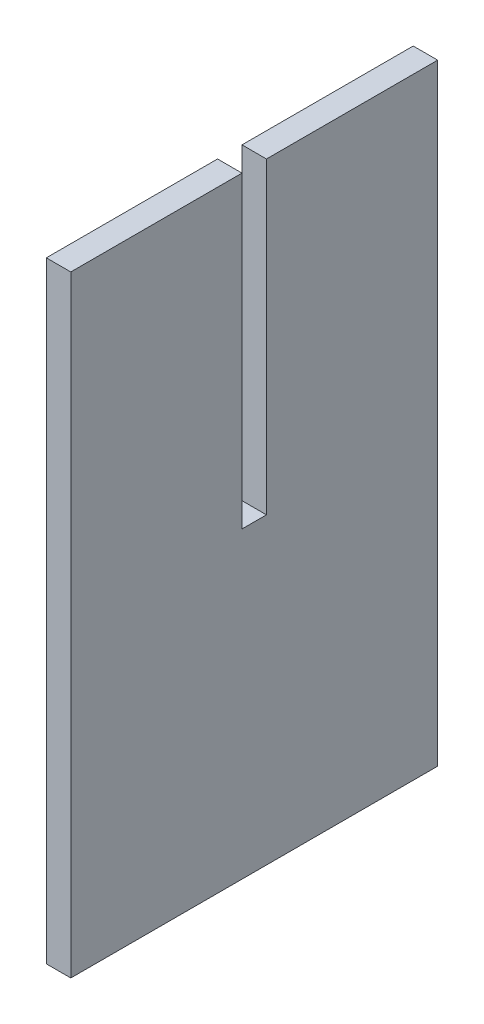
ISO-10303-21;
HEADER;
FILE_DESCRIPTION(('STEP AP214'),'2;1');
FILE_NAME('part.step','',(''),(''),'','','');
FILE_SCHEMA(('AUTOMOTIVE_DESIGN { 1 0 10303 214 1 1 1 1 }'));
ENDSEC;
DATA;
#1=APPLICATION_CONTEXT('core data for automotive mechanical design processes');
#2=APPLICATION_PROTOCOL_DEFINITION('international standard','automotive_design',2000,#1);
#3=PRODUCT_CONTEXT('',#1,'mechanical');
#4=PRODUCT('Part','Part','',(#3));
#5=PRODUCT_RELATED_PRODUCT_CATEGORY('part','',(#4));
#6=PRODUCT_DEFINITION_FORMATION('','',#4);
#7=PRODUCT_DEFINITION_CONTEXT('part definition',#1,'design');
#8=PRODUCT_DEFINITION('design','',#6,#7);
#9=PRODUCT_DEFINITION_SHAPE('','',#8);
#10=(LENGTH_UNIT() NAMED_UNIT(*) SI_UNIT(.MILLI.,.METRE.));
#11=(NAMED_UNIT(*) PLANE_ANGLE_UNIT() SI_UNIT($,.RADIAN.));
#12=(NAMED_UNIT(*) SI_UNIT($,.STERADIAN.) SOLID_ANGLE_UNIT());
#13=UNCERTAINTY_MEASURE_WITH_UNIT(LENGTH_MEASURE(1.E-05),#10,'distance_accuracy_value','');
#14=(GEOMETRIC_REPRESENTATION_CONTEXT(3) GLOBAL_UNCERTAINTY_ASSIGNED_CONTEXT((#13)) GLOBAL_UNIT_ASSIGNED_CONTEXT((#10,
#11,#12)) REPRESENTATION_CONTEXT('',''));
#15=CARTESIAN_POINT('',(0.,0.,0.));
#16=DIRECTION('',(0.,0.,1.));
#17=DIRECTION('',(1.,0.,0.));
#18=AXIS2_PLACEMENT_3D('',#15,#16,#17);
#19=CARTESIAN_POINT('',(2.,0.,0.));
#20=DIRECTION('',(0.,-1.,0.));
#21=DIRECTION('',(0.,0.,-1.));
#22=AXIS2_PLACEMENT_3D('',#19,#20,#21);
#23=PLANE('',#22);
#24=DIRECTION('',(0.,0.,1.));
#25=VECTOR('',#24,1.);
#26=CARTESIAN_POINT('',(2.,0.,0.));
#27=LINE('',#26,#25);
#28=CARTESIAN_POINT('',(2.,0.,-14.));
#29=VERTEX_POINT('',#28);
#30=CARTESIAN_POINT('',(2.,0.,0.));
#31=VERTEX_POINT('',#30);
#32=EDGE_CURVE('E59',#29,#31,#27,.T.);
#33=ORIENTED_EDGE('',*,*,#32,.F.);
#34=DIRECTION('',(1.,0.,0.));
#35=VECTOR('',#34,1.);
#36=CARTESIAN_POINT('',(0.,0.,-14.));
#37=LINE('',#36,#35);
#38=CARTESIAN_POINT('',(0.,0.,-14.));
#39=VERTEX_POINT('',#38);
#40=EDGE_CURVE('E135',#39,#29,#37,.T.);
#41=ORIENTED_EDGE('',*,*,#40,.F.);
#42=DIRECTION('',(0.,0.,1.));
#43=VECTOR('',#42,1.);
#44=CARTESIAN_POINT('',(0.,0.,0.));
#45=LINE('',#44,#43);
#46=CARTESIAN_POINT('',(0.,0.,0.));
#47=VERTEX_POINT('',#46);
#48=EDGE_CURVE('E81',#39,#47,#45,.T.);
#49=ORIENTED_EDGE('',*,*,#48,.T.);
#50=DIRECTION('',(-1.,0.,0.));
#51=VECTOR('',#50,1.);
#52=CARTESIAN_POINT('',(2.,0.,0.));
#53=LINE('',#52,#51);
#54=EDGE_CURVE('E151',#31,#47,#53,.T.);
#55=ORIENTED_EDGE('',*,*,#54,.F.);
#56=EDGE_LOOP('',(#33,#41,#49,#55));
#57=FACE_BOUND('',#56,.T.);
#58=ADVANCED_FACE('F35',(#57),#23,.F.);
#59=CARTESIAN_POINT('',(2.,0.,0.));
#60=DIRECTION('',(0.,0.,-1.));
#61=DIRECTION('',(0.,1.,0.));
#62=AXIS2_PLACEMENT_3D('',#59,#60,#61);
#63=PLANE('',#62);
#64=DIRECTION('',(0.,-1.,0.));
#65=VECTOR('',#64,1.);
#66=CARTESIAN_POINT('',(0.,0.,0.));
#67=LINE('',#66,#65);
#68=CARTESIAN_POINT('',(0.,-50.,0.));
#69=VERTEX_POINT('',#68);
#70=EDGE_CURVE('E137',#47,#69,#67,.T.);
#71=ORIENTED_EDGE('',*,*,#70,.T.);
#72=DIRECTION('',(-1.,0.,0.));
#73=VECTOR('',#72,1.);
#74=CARTESIAN_POINT('',(2.,-50.,0.));
#75=LINE('',#74,#73);
#76=CARTESIAN_POINT('',(2.,-50.,0.));
#77=VERTEX_POINT('',#76);
#78=EDGE_CURVE('E11',#77,#69,#75,.T.);
#79=ORIENTED_EDGE('',*,*,#78,.F.);
#80=DIRECTION('',(0.,-1.,0.));
#81=VECTOR('',#80,1.);
#82=CARTESIAN_POINT('',(2.,0.,0.));
#83=LINE('',#82,#81);
#84=EDGE_CURVE('E142',#31,#77,#83,.T.);
#85=ORIENTED_EDGE('',*,*,#84,.F.);
#86=ORIENTED_EDGE('',*,*,#54,.T.);
#87=EDGE_LOOP('',(#71,#79,#85,#86));
#88=FACE_BOUND('',#87,.T.);
#89=ADVANCED_FACE('F37',(#88),#63,.F.);
#90=CARTESIAN_POINT('',(2.,-50.,0.));
#91=DIRECTION('',(0.,1.,0.));
#92=DIRECTION('',(0.,0.,1.));
#93=AXIS2_PLACEMENT_3D('',#90,#91,#92);
#94=PLANE('',#93);
#95=DIRECTION('',(0.,0.,-1.));
#96=VECTOR('',#95,1.);
#97=CARTESIAN_POINT('',(0.,-50.,0.));
#98=LINE('',#97,#96);
#99=CARTESIAN_POINT('',(0.,-50.,-30.));
#100=VERTEX_POINT('',#99);
#101=EDGE_CURVE('E154',#69,#100,#98,.T.);
#102=ORIENTED_EDGE('',*,*,#101,.T.);
#103=DIRECTION('',(-1.,0.,0.));
#104=VECTOR('',#103,1.);
#105=CARTESIAN_POINT('',(2.,-50.,-30.));
#106=LINE('',#105,#104);
#107=CARTESIAN_POINT('',(2.,-50.,-30.));
#108=VERTEX_POINT('',#107);
#109=EDGE_CURVE('E43',#108,#100,#106,.T.);
#110=ORIENTED_EDGE('',*,*,#109,.F.);
#111=DIRECTION('',(0.,0.,-1.));
#112=VECTOR('',#111,1.);
#113=CARTESIAN_POINT('',(2.,-50.,0.));
#114=LINE('',#113,#112);
#115=EDGE_CURVE('E88',#77,#108,#114,.T.);
#116=ORIENTED_EDGE('',*,*,#115,.F.);
#117=ORIENTED_EDGE('',*,*,#78,.T.);
#118=EDGE_LOOP('',(#102,#110,#116,#117));
#119=FACE_BOUND('',#118,.T.);
#120=ADVANCED_FACE('F178',(#119),#94,.F.);
#121=CARTESIAN_POINT('',(2.,0.,-30.));
#122=DIRECTION('',(0.,0.,1.));
#123=DIRECTION('',(0.,-1.,0.));
#124=AXIS2_PLACEMENT_3D('',#121,#122,#123);
#125=PLANE('',#124);
#126=DIRECTION('',(0.,1.,0.));
#127=VECTOR('',#126,1.);
#128=CARTESIAN_POINT('',(0.,0.,-30.));
#129=LINE('',#128,#127);
#130=CARTESIAN_POINT('',(0.,0.,-30.));
#131=VERTEX_POINT('',#130);
#132=EDGE_CURVE('E156',#100,#131,#129,.T.);
#133=ORIENTED_EDGE('',*,*,#132,.T.);
#134=DIRECTION('',(-1.,0.,0.));
#135=VECTOR('',#134,1.);
#136=CARTESIAN_POINT('',(2.,0.,-30.));
#137=LINE('',#136,#135);
#138=CARTESIAN_POINT('',(2.,0.,-30.));
#139=VERTEX_POINT('',#138);
#140=EDGE_CURVE('E161',#139,#131,#137,.T.);
#141=ORIENTED_EDGE('',*,*,#140,.F.);
#142=DIRECTION('',(0.,1.,0.));
#143=VECTOR('',#142,1.);
#144=CARTESIAN_POINT('',(2.,0.,-30.));
#145=LINE('',#144,#143);
#146=EDGE_CURVE('E146',#108,#139,#145,.T.);
#147=ORIENTED_EDGE('',*,*,#146,.F.);
#148=ORIENTED_EDGE('',*,*,#109,.T.);
#149=EDGE_LOOP('',(#133,#141,#147,#148));
#150=FACE_BOUND('',#149,.T.);
#151=ADVANCED_FACE('F167',(#150),#125,.F.);
#152=CARTESIAN_POINT('',(0.,0.,-16.));
#153=VERTEX_POINT('',#152);
#154=EDGE_CURVE('E144',#131,#153,#45,.T.);
#155=ORIENTED_EDGE('',*,*,#154,.T.);
#156=DIRECTION('',(1.,0.,0.));
#157=VECTOR('',#156,1.);
#158=CARTESIAN_POINT('',(0.,0.,-16.));
#159=LINE('',#158,#157);
#160=CARTESIAN_POINT('',(2.,0.,-16.));
#161=VERTEX_POINT('',#160);
#162=EDGE_CURVE('E138',#153,#161,#159,.T.);
#163=ORIENTED_EDGE('',*,*,#162,.T.);
#164=EDGE_CURVE('E148',#139,#161,#27,.T.);
#165=ORIENTED_EDGE('',*,*,#164,.F.);
#166=ORIENTED_EDGE('',*,*,#140,.T.);
#167=EDGE_LOOP('',(#155,#163,#165,#166));
#168=FACE_BOUND('',#167,.T.);
#169=ADVANCED_FACE('F171',(#168),#23,.F.);
#170=CARTESIAN_POINT('',(2.,0.,0.));
#171=DIRECTION('',(1.,0.,0.));
#172=DIRECTION('',(0.,0.,-1.));
#173=AXIS2_PLACEMENT_3D('',#170,#171,#172);
#174=PLANE('',#173);
#175=DIRECTION('',(0.,-1.,0.));
#176=VECTOR('',#175,1.);
#177=CARTESIAN_POINT('',(2.,0.,-14.));
#178=LINE('',#177,#176);
#179=CARTESIAN_POINT('',(2.,-25.2,-14.));
#180=VERTEX_POINT('',#179);
#181=EDGE_CURVE('E114',#29,#180,#178,.T.);
#182=ORIENTED_EDGE('',*,*,#181,.F.);
#183=ORIENTED_EDGE('',*,*,#32,.T.);
#184=ORIENTED_EDGE('',*,*,#84,.T.);
#185=ORIENTED_EDGE('',*,*,#115,.T.);
#186=ORIENTED_EDGE('',*,*,#146,.T.);
#187=ORIENTED_EDGE('',*,*,#164,.T.);
#188=DIRECTION('',(0.,1.,0.));
#189=VECTOR('',#188,1.);
#190=CARTESIAN_POINT('',(2.,0.,-16.));
#191=LINE('',#190,#189);
#192=CARTESIAN_POINT('',(2.,-25.2,-16.));
#193=VERTEX_POINT('',#192);
#194=EDGE_CURVE('E127',#193,#161,#191,.T.);
#195=ORIENTED_EDGE('',*,*,#194,.F.);
#196=DIRECTION('',(0.,0.,-1.));
#197=VECTOR('',#196,1.);
#198=CARTESIAN_POINT('',(2.,-25.2,-14.));
#199=LINE('',#198,#197);
#200=EDGE_CURVE('E129',#180,#193,#199,.T.);
#201=ORIENTED_EDGE('',*,*,#200,.F.);
#202=EDGE_LOOP('',(#182,#183,#184,#185,#186,#187,#195,#201));
#203=FACE_BOUND('',#202,.T.);
#204=ADVANCED_FACE('F174',(#203),#174,.T.);
#205=CARTESIAN_POINT('',(0.,0.,0.));
#206=DIRECTION('',(1.,0.,0.));
#207=DIRECTION('',(0.,0.,-1.));
#208=AXIS2_PLACEMENT_3D('',#205,#206,#207);
#209=PLANE('',#208);
#210=ORIENTED_EDGE('',*,*,#48,.F.);
#211=DIRECTION('',(0.,-1.,0.));
#212=VECTOR('',#211,1.);
#213=CARTESIAN_POINT('',(0.,0.,-14.));
#214=LINE('',#213,#212);
#215=CARTESIAN_POINT('',(0.,-25.2,-14.));
#216=VERTEX_POINT('',#215);
#217=EDGE_CURVE('E113',#39,#216,#214,.T.);
#218=ORIENTED_EDGE('',*,*,#217,.T.);
#219=DIRECTION('',(0.,0.,-1.));
#220=VECTOR('',#219,1.);
#221=CARTESIAN_POINT('',(0.,-25.2,-14.));
#222=LINE('',#221,#220);
#223=CARTESIAN_POINT('',(0.,-25.2,-16.));
#224=VERTEX_POINT('',#223);
#225=EDGE_CURVE('E121',#216,#224,#222,.T.);
#226=ORIENTED_EDGE('',*,*,#225,.T.);
#227=DIRECTION('',(0.,1.,0.));
#228=VECTOR('',#227,1.);
#229=CARTESIAN_POINT('',(0.,0.,-16.));
#230=LINE('',#229,#228);
#231=EDGE_CURVE('E50',#224,#153,#230,.T.);
#232=ORIENTED_EDGE('',*,*,#231,.T.);
#233=ORIENTED_EDGE('',*,*,#154,.F.);
#234=ORIENTED_EDGE('',*,*,#132,.F.);
#235=ORIENTED_EDGE('',*,*,#101,.F.);
#236=ORIENTED_EDGE('',*,*,#70,.F.);
#237=EDGE_LOOP('',(#210,#218,#226,#232,#233,#234,#235,#236));
#238=FACE_BOUND('',#237,.T.);
#239=ADVANCED_FACE('F125',(#238),#209,.F.);
#240=CARTESIAN_POINT('',(0.,0.,-14.));
#241=DIRECTION('',(0.,0.,1.));
#242=DIRECTION('',(0.,-1.,0.));
#243=AXIS2_PLACEMENT_3D('',#240,#241,#242);
#244=PLANE('',#243);
#245=ORIENTED_EDGE('',*,*,#181,.T.);
#246=DIRECTION('',(1.,0.,0.));
#247=VECTOR('',#246,1.);
#248=CARTESIAN_POINT('',(0.,-25.2,-14.));
#249=LINE('',#248,#247);
#250=EDGE_CURVE('E109',#216,#180,#249,.T.);
#251=ORIENTED_EDGE('',*,*,#250,.F.);
#252=ORIENTED_EDGE('',*,*,#217,.F.);
#253=ORIENTED_EDGE('',*,*,#40,.T.);
#254=EDGE_LOOP('',(#245,#251,#252,#253));
#255=FACE_BOUND('',#254,.T.);
#256=ADVANCED_FACE('F111',(#255),#244,.F.);
#257=CARTESIAN_POINT('',(0.,0.,-16.));
#258=DIRECTION('',(0.,0.,-1.));
#259=DIRECTION('',(-1.,0.,0.));
#260=AXIS2_PLACEMENT_3D('',#257,#258,#259);
#261=PLANE('',#260);
#262=ORIENTED_EDGE('',*,*,#194,.T.);
#263=ORIENTED_EDGE('',*,*,#162,.F.);
#264=ORIENTED_EDGE('',*,*,#231,.F.);
#265=DIRECTION('',(1.,0.,0.));
#266=VECTOR('',#265,1.);
#267=CARTESIAN_POINT('',(0.,-25.2,-16.));
#268=LINE('',#267,#266);
#269=EDGE_CURVE('E118',#224,#193,#268,.T.);
#270=ORIENTED_EDGE('',*,*,#269,.T.);
#271=EDGE_LOOP('',(#262,#263,#264,#270));
#272=FACE_BOUND('',#271,.T.);
#273=ADVANCED_FACE('F201',(#272),#261,.F.);
#274=CARTESIAN_POINT('',(0.,-25.2,-14.));
#275=DIRECTION('',(0.,-1.,0.));
#276=DIRECTION('',(0.,0.,-1.));
#277=AXIS2_PLACEMENT_3D('',#274,#275,#276);
#278=PLANE('',#277);
#279=ORIENTED_EDGE('',*,*,#200,.T.);
#280=ORIENTED_EDGE('',*,*,#269,.F.);
#281=ORIENTED_EDGE('',*,*,#225,.F.);
#282=ORIENTED_EDGE('',*,*,#250,.T.);
#283=EDGE_LOOP('',(#279,#280,#281,#282));
#284=FACE_BOUND('',#283,.T.);
#285=ADVANCED_FACE('F122',(#284),#278,.F.);
#286=CLOSED_SHELL('',(#58,#89,#120,#151,#169,#204,#239,#256,#273,#285));
#287=MANIFOLD_SOLID_BREP('B2',#286);
#288=ADVANCED_BREP_SHAPE_REPRESENTATION('',(#18,#287),#14);
#289=SHAPE_DEFINITION_REPRESENTATION(#9,#288);
ENDSEC;
END-ISO-10303-21;
